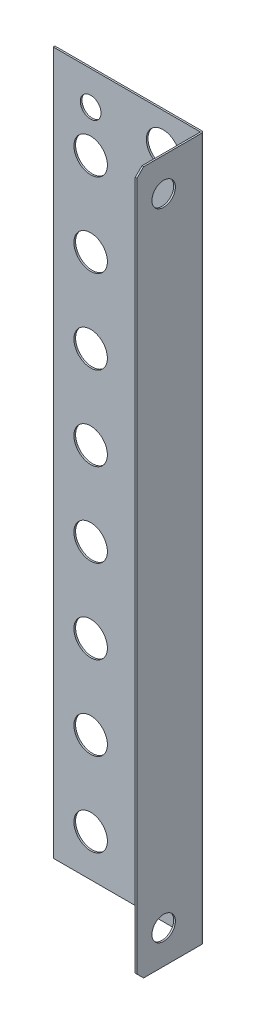
ISO-10303-21;
HEADER;
FILE_DESCRIPTION(('STEP AP214'),'2;1');
FILE_NAME('part.step','',(''),(''),'','','');
FILE_SCHEMA(('AUTOMOTIVE_DESIGN { 1 0 10303 214 1 1 1 1 }'));
ENDSEC;
DATA;
#1=APPLICATION_CONTEXT('core data for automotive mechanical design processes');
#2=APPLICATION_PROTOCOL_DEFINITION('international standard','automotive_design',2000,#1);
#3=PRODUCT_CONTEXT('',#1,'mechanical');
#4=PRODUCT('Part','Part','',(#3));
#5=PRODUCT_RELATED_PRODUCT_CATEGORY('part','',(#4));
#6=PRODUCT_DEFINITION_FORMATION('','',#4);
#7=PRODUCT_DEFINITION_CONTEXT('part definition',#1,'design');
#8=PRODUCT_DEFINITION('design','',#6,#7);
#9=PRODUCT_DEFINITION_SHAPE('','',#8);
#10=(LENGTH_UNIT() NAMED_UNIT(*) SI_UNIT(.MILLI.,.METRE.));
#11=(NAMED_UNIT(*) PLANE_ANGLE_UNIT() SI_UNIT($,.RADIAN.));
#12=(NAMED_UNIT(*) SI_UNIT($,.STERADIAN.) SOLID_ANGLE_UNIT());
#13=UNCERTAINTY_MEASURE_WITH_UNIT(LENGTH_MEASURE(1.E-05),#10,'distance_accuracy_value','');
#14=(GEOMETRIC_REPRESENTATION_CONTEXT(3) GLOBAL_UNCERTAINTY_ASSIGNED_CONTEXT((#13)) GLOBAL_UNIT_ASSIGNED_CONTEXT((#10,
#11,#12)) REPRESENTATION_CONTEXT('',''));
#15=CARTESIAN_POINT('',(0.,0.,0.));
#16=DIRECTION('',(0.,0.,1.));
#17=DIRECTION('',(1.,0.,0.));
#18=AXIS2_PLACEMENT_3D('',#15,#16,#17);
#19=CARTESIAN_POINT('',(-22.,105.,-0.5));
#20=DIRECTION('',(0.,1.,0.));
#21=DIRECTION('',(0.,0.,1.));
#22=AXIS2_PLACEMENT_3D('',#19,#20,#21);
#23=PLANE('',#22);
#24=DIRECTION('',(-1.,0.,0.));
#25=VECTOR('',#24,1.);
#26=CARTESIAN_POINT('',(-22.,105.,0.));
#27=LINE('',#26,#25);
#28=CARTESIAN_POINT('',(21.95,105.,0.));
#29=VERTEX_POINT('',#28);
#30=CARTESIAN_POINT('',(-22.,105.,0.));
#31=VERTEX_POINT('',#30);
#32=EDGE_CURVE('E205',#29,#31,#27,.T.);
#33=ORIENTED_EDGE('',*,*,#32,.F.);
#34=DIRECTION('',(-2.77555756156204E-13,0.,-1.));
#35=VECTOR('',#34,1.);
#36=CARTESIAN_POINT('',(21.95,105.,0.));
#37=LINE('',#36,#35);
#38=CARTESIAN_POINT('',(21.9499999999998,105.,-0.500000000000012));
#39=VERTEX_POINT('',#38);
#40=EDGE_CURVE('E163',#29,#39,#37,.T.);
#41=ORIENTED_EDGE('',*,*,#40,.T.);
#42=DIRECTION('',(-1.,0.,0.));
#43=VECTOR('',#42,1.);
#44=CARTESIAN_POINT('',(-22.,105.,-0.5));
#45=LINE('',#44,#43);
#46=CARTESIAN_POINT('',(-22.,105.,-0.5));
#47=VERTEX_POINT('',#46);
#48=EDGE_CURVE('E195',#39,#47,#45,.T.);
#49=ORIENTED_EDGE('',*,*,#48,.T.);
#50=DIRECTION('',(0.,0.,1.));
#51=VECTOR('',#50,1.);
#52=CARTESIAN_POINT('',(-22.,105.,-0.5));
#53=LINE('',#52,#51);
#54=EDGE_CURVE('E204',#47,#31,#53,.T.);
#55=ORIENTED_EDGE('',*,*,#54,.T.);
#56=EDGE_LOOP('',(#33,#41,#49,#55));
#57=FACE_BOUND('',#56,.T.);
#58=ADVANCED_FACE('F40',(#57),#23,.T.);
#59=CARTESIAN_POINT('',(0.,0.,-0.5));
#60=DIRECTION('',(0.,0.,1.));
#61=DIRECTION('',(1.,0.,0.));
#62=AXIS2_PLACEMENT_3D('',#59,#60,#61);
#63=PLANE('',#62);
#64=CARTESIAN_POINT('',(-10.8253175473055,95.,-0.500000000000012));
#65=DIRECTION('',(0.,0.,1.));
#66=DIRECTION('',(1.,0.,0.));
#67=AXIS2_PLACEMENT_3D('',#64,#65,#66);
#68=CIRCLE('',#67,3.10000000000001);
#69=CARTESIAN_POINT('',(-7.72531754730549,95.,-0.500000000000012));
#70=VERTEX_POINT('',#69);
#71=EDGE_CURVE('E315',#70,#70,#68,.T.);
#72=ORIENTED_EDGE('',*,*,#71,.T.);
#73=EDGE_LOOP('',(#72));
#74=FACE_BOUND('',#73,.T.);
#75=CARTESIAN_POINT('',(10.8253175473055,-92.5,-0.500000000000012));
#76=DIRECTION('',(0.,0.,1.));
#77=DIRECTION('',(1.,0.,0.));
#78=AXIS2_PLACEMENT_3D('',#75,#76,#77);
#79=CIRCLE('',#78,3.1);
#80=CARTESIAN_POINT('',(13.9253175473055,-92.5,-0.500000000000012));
#81=VERTEX_POINT('',#80);
#82=EDGE_CURVE('E320',#81,#81,#79,.T.);
#83=ORIENTED_EDGE('',*,*,#82,.T.);
#84=EDGE_LOOP('',(#83));
#85=FACE_BOUND('',#84,.T.);
#86=CARTESIAN_POINT('',(-10.8253175473055,-92.5,-0.5));
#87=DIRECTION('',(0.,0.,1.));
#88=DIRECTION('',(1.,0.,0.));
#89=AXIS2_PLACEMENT_3D('',#86,#87,#88);
#90=CIRCLE('',#89,5.);
#91=CARTESIAN_POINT('',(-5.82531754730547,-92.5,-0.5));
#92=VERTEX_POINT('',#91);
#93=EDGE_CURVE('E290',#92,#92,#90,.T.);
#94=ORIENTED_EDGE('',*,*,#93,.T.);
#95=EDGE_LOOP('',(#94));
#96=FACE_BOUND('',#95,.T.);
#97=CARTESIAN_POINT('',(-10.8253175473055,-67.5,-0.5));
#98=DIRECTION('',(0.,0.,1.));
#99=DIRECTION('',(1.,0.,0.));
#100=AXIS2_PLACEMENT_3D('',#97,#98,#99);
#101=CIRCLE('',#100,5.);
#102=CARTESIAN_POINT('',(-5.82531754730547,-67.5,-0.5));
#103=VERTEX_POINT('',#102);
#104=EDGE_CURVE('E284',#103,#103,#101,.T.);
#105=ORIENTED_EDGE('',*,*,#104,.T.);
#106=EDGE_LOOP('',(#105));
#107=FACE_BOUND('',#106,.T.);
#108=CARTESIAN_POINT('',(-10.8253175473055,-42.5,-0.5));
#109=DIRECTION('',(0.,0.,1.));
#110=DIRECTION('',(1.,0.,0.));
#111=AXIS2_PLACEMENT_3D('',#108,#109,#110);
#112=CIRCLE('',#111,5.);
#113=CARTESIAN_POINT('',(-5.82531754730547,-42.5,-0.5));
#114=VERTEX_POINT('',#113);
#115=EDGE_CURVE('E278',#114,#114,#112,.T.);
#116=ORIENTED_EDGE('',*,*,#115,.T.);
#117=EDGE_LOOP('',(#116));
#118=FACE_BOUND('',#117,.T.);
#119=CARTESIAN_POINT('',(-10.8253175473055,-17.5,-0.5));
#120=DIRECTION('',(0.,0.,1.));
#121=DIRECTION('',(1.,0.,0.));
#122=AXIS2_PLACEMENT_3D('',#119,#120,#121);
#123=CIRCLE('',#122,5.);
#124=CARTESIAN_POINT('',(-5.82531754730548,-17.5,-0.5));
#125=VERTEX_POINT('',#124);
#126=EDGE_CURVE('E272',#125,#125,#123,.T.);
#127=ORIENTED_EDGE('',*,*,#126,.T.);
#128=EDGE_LOOP('',(#127));
#129=FACE_BOUND('',#128,.T.);
#130=CARTESIAN_POINT('',(-10.8253175473055,7.49999999999999,-0.5));
#131=DIRECTION('',(0.,0.,1.));
#132=DIRECTION('',(1.,0.,0.));
#133=AXIS2_PLACEMENT_3D('',#130,#131,#132);
#134=CIRCLE('',#133,5.);
#135=CARTESIAN_POINT('',(-5.82531754730548,7.49999999999999,-0.5));
#136=VERTEX_POINT('',#135);
#137=EDGE_CURVE('E266',#136,#136,#134,.T.);
#138=ORIENTED_EDGE('',*,*,#137,.T.);
#139=EDGE_LOOP('',(#138));
#140=FACE_BOUND('',#139,.T.);
#141=CARTESIAN_POINT('',(-10.8253175473055,32.5,-0.5));
#142=DIRECTION('',(0.,0.,1.));
#143=DIRECTION('',(1.,0.,0.));
#144=AXIS2_PLACEMENT_3D('',#141,#142,#143);
#145=CIRCLE('',#144,5.);
#146=CARTESIAN_POINT('',(-5.82531754730548,32.5,-0.5));
#147=VERTEX_POINT('',#146);
#148=EDGE_CURVE('E260',#147,#147,#145,.T.);
#149=ORIENTED_EDGE('',*,*,#148,.T.);
#150=EDGE_LOOP('',(#149));
#151=FACE_BOUND('',#150,.T.);
#152=CARTESIAN_POINT('',(10.8253175473055,-80.,-0.5));
#153=DIRECTION('',(0.,0.,1.));
#154=DIRECTION('',(1.,0.,0.));
#155=AXIS2_PLACEMENT_3D('',#152,#153,#154);
#156=CIRCLE('',#155,5.);
#157=CARTESIAN_POINT('',(15.8253175473055,-80.,-0.5));
#158=VERTEX_POINT('',#157);
#159=EDGE_CURVE('E254',#158,#158,#156,.T.);
#160=ORIENTED_EDGE('',*,*,#159,.T.);
#161=EDGE_LOOP('',(#160));
#162=FACE_BOUND('',#161,.T.);
#163=CARTESIAN_POINT('',(10.8253175473055,-55.,-0.5));
#164=DIRECTION('',(0.,0.,1.));
#165=DIRECTION('',(1.,0.,0.));
#166=AXIS2_PLACEMENT_3D('',#163,#164,#165);
#167=CIRCLE('',#166,5.);
#168=CARTESIAN_POINT('',(15.8253175473055,-55.,-0.5));
#169=VERTEX_POINT('',#168);
#170=EDGE_CURVE('E248',#169,#169,#167,.T.);
#171=ORIENTED_EDGE('',*,*,#170,.T.);
#172=EDGE_LOOP('',(#171));
#173=FACE_BOUND('',#172,.T.);
#174=CARTESIAN_POINT('',(10.8253175473055,-30.,-0.5));
#175=DIRECTION('',(0.,0.,1.));
#176=DIRECTION('',(1.,0.,0.));
#177=AXIS2_PLACEMENT_3D('',#174,#175,#176);
#178=CIRCLE('',#177,5.);
#179=CARTESIAN_POINT('',(15.8253175473055,-30.,-0.5));
#180=VERTEX_POINT('',#179);
#181=EDGE_CURVE('E242',#180,#180,#178,.T.);
#182=ORIENTED_EDGE('',*,*,#181,.T.);
#183=EDGE_LOOP('',(#182));
#184=FACE_BOUND('',#183,.T.);
#185=CARTESIAN_POINT('',(10.8253175473055,-5.,-0.5));
#186=DIRECTION('',(0.,0.,1.));
#187=DIRECTION('',(1.,0.,0.));
#188=AXIS2_PLACEMENT_3D('',#185,#186,#187);
#189=CIRCLE('',#188,5.);
#190=CARTESIAN_POINT('',(15.8253175473055,-5.,-0.5));
#191=VERTEX_POINT('',#190);
#192=EDGE_CURVE('E236',#191,#191,#189,.T.);
#193=ORIENTED_EDGE('',*,*,#192,.T.);
#194=EDGE_LOOP('',(#193));
#195=FACE_BOUND('',#194,.T.);
#196=CARTESIAN_POINT('',(10.8253175473055,20.,-0.5));
#197=DIRECTION('',(0.,0.,1.));
#198=DIRECTION('',(1.,0.,0.));
#199=AXIS2_PLACEMENT_3D('',#196,#197,#198);
#200=CIRCLE('',#199,5.);
#201=CARTESIAN_POINT('',(15.8253175473055,20.,-0.5));
#202=VERTEX_POINT('',#201);
#203=EDGE_CURVE('E230',#202,#202,#200,.T.);
#204=ORIENTED_EDGE('',*,*,#203,.T.);
#205=EDGE_LOOP('',(#204));
#206=FACE_BOUND('',#205,.T.);
#207=CARTESIAN_POINT('',(10.8253175473055,45.,-0.5));
#208=DIRECTION('',(0.,0.,1.));
#209=DIRECTION('',(1.,0.,0.));
#210=AXIS2_PLACEMENT_3D('',#207,#208,#209);
#211=CIRCLE('',#210,5.);
#212=CARTESIAN_POINT('',(15.8253175473055,45.,-0.5));
#213=VERTEX_POINT('',#212);
#214=EDGE_CURVE('E224',#213,#213,#211,.T.);
#215=ORIENTED_EDGE('',*,*,#214,.T.);
#216=EDGE_LOOP('',(#215));
#217=FACE_BOUND('',#216,.T.);
#218=CARTESIAN_POINT('',(-10.8253175473055,82.5,-0.5));
#219=DIRECTION('',(0.,0.,1.));
#220=DIRECTION('',(1.,0.,0.));
#221=AXIS2_PLACEMENT_3D('',#218,#219,#220);
#222=CIRCLE('',#221,5.);
#223=CARTESIAN_POINT('',(-5.82531754730549,82.5,-0.5));
#224=VERTEX_POINT('',#223);
#225=EDGE_CURVE('E188',#224,#224,#222,.T.);
#226=ORIENTED_EDGE('',*,*,#225,.T.);
#227=EDGE_LOOP('',(#226));
#228=FACE_BOUND('',#227,.T.);
#229=CARTESIAN_POINT('',(10.8253175473055,95.,-0.5));
#230=DIRECTION('',(0.,0.,1.));
#231=DIRECTION('',(1.,0.,0.));
#232=AXIS2_PLACEMENT_3D('',#229,#230,#231);
#233=CIRCLE('',#232,5.);
#234=CARTESIAN_POINT('',(15.8253175473055,95.,-0.5));
#235=VERTEX_POINT('',#234);
#236=EDGE_CURVE('E189',#235,#235,#233,.T.);
#237=ORIENTED_EDGE('',*,*,#236,.T.);
#238=EDGE_LOOP('',(#237));
#239=FACE_BOUND('',#238,.T.);
#240=CARTESIAN_POINT('',(10.8253175473055,70.,-0.5));
#241=DIRECTION('',(0.,0.,1.));
#242=DIRECTION('',(1.,0.,0.));
#243=AXIS2_PLACEMENT_3D('',#240,#241,#242);
#244=CIRCLE('',#243,5.);
#245=CARTESIAN_POINT('',(15.8253175473055,70.,-0.5));
#246=VERTEX_POINT('',#245);
#247=EDGE_CURVE('E185',#246,#246,#244,.T.);
#248=ORIENTED_EDGE('',*,*,#247,.T.);
#249=EDGE_LOOP('',(#248));
#250=FACE_BOUND('',#249,.T.);
#251=CARTESIAN_POINT('',(-10.8253175473055,57.5,-0.5));
#252=DIRECTION('',(0.,0.,1.));
#253=DIRECTION('',(1.,0.,0.));
#254=AXIS2_PLACEMENT_3D('',#251,#252,#253);
#255=CIRCLE('',#254,5.);
#256=CARTESIAN_POINT('',(-5.82531754730549,57.5,-0.5));
#257=VERTEX_POINT('',#256);
#258=EDGE_CURVE('E179',#257,#257,#255,.T.);
#259=ORIENTED_EDGE('',*,*,#258,.T.);
#260=EDGE_LOOP('',(#259));
#261=FACE_BOUND('',#260,.T.);
#262=DIRECTION('',(0.,1.,0.));
#263=VECTOR('',#262,1.);
#264=CARTESIAN_POINT('',(21.9499999999998,105.,-0.500000000000012));
#265=LINE('',#264,#263);
#266=CARTESIAN_POINT('',(21.95,-105.,-0.5));
#267=VERTEX_POINT('',#266);
#268=EDGE_CURVE('E128',#39,#267,#265,.F.);
#269=ORIENTED_EDGE('',*,*,#268,.T.);
#270=DIRECTION('',(1.,0.,0.));
#271=VECTOR('',#270,1.);
#272=CARTESIAN_POINT('',(-22.,-105.,-0.5));
#273=LINE('',#272,#271);
#274=CARTESIAN_POINT('',(-22.,-105.,-0.5));
#275=VERTEX_POINT('',#274);
#276=EDGE_CURVE('E201',#275,#267,#273,.T.);
#277=ORIENTED_EDGE('',*,*,#276,.F.);
#278=DIRECTION('',(0.,-1.,0.));
#279=VECTOR('',#278,1.);
#280=CARTESIAN_POINT('',(-22.,105.,-0.5));
#281=LINE('',#280,#279);
#282=EDGE_CURVE('E197',#47,#275,#281,.T.);
#283=ORIENTED_EDGE('',*,*,#282,.F.);
#284=ORIENTED_EDGE('',*,*,#48,.F.);
#285=EDGE_LOOP('',(#269,#277,#283,#284));
#286=FACE_BOUND('',#285,.T.);
#287=ADVANCED_FACE('F370',(#74,#85,#96,#107,#118,#129,#140,#151,#162,#173,#184,#195,#206,#217,
#228,#239,#250,#261,#286),#63,.F.);
#288=CARTESIAN_POINT('',(0.,0.,0.));
#289=DIRECTION('',(0.,0.,1.));
#290=DIRECTION('',(1.,0.,0.));
#291=AXIS2_PLACEMENT_3D('',#288,#289,#290);
#292=PLANE('',#291);
#293=CARTESIAN_POINT('',(-10.8253175473055,95.,0.));
#294=DIRECTION('',(0.,0.,1.));
#295=DIRECTION('',(1.,0.,0.));
#296=AXIS2_PLACEMENT_3D('',#293,#294,#295);
#297=CIRCLE('',#296,3.10000000000001);
#298=CARTESIAN_POINT('',(-7.72531754730549,95.,0.));
#299=VERTEX_POINT('',#298);
#300=EDGE_CURVE('E45',#299,#299,#297,.T.);
#301=ORIENTED_EDGE('',*,*,#300,.F.);
#302=EDGE_LOOP('',(#301));
#303=FACE_BOUND('',#302,.T.);
#304=CARTESIAN_POINT('',(10.8253175473055,-92.5,0.));
#305=DIRECTION('',(0.,0.,1.));
#306=DIRECTION('',(1.,0.,0.));
#307=AXIS2_PLACEMENT_3D('',#304,#305,#306);
#308=CIRCLE('',#307,3.1);
#309=CARTESIAN_POINT('',(13.9253175473055,-92.5,0.));
#310=VERTEX_POINT('',#309);
#311=EDGE_CURVE('E313',#310,#310,#308,.T.);
#312=ORIENTED_EDGE('',*,*,#311,.F.);
#313=EDGE_LOOP('',(#312));
#314=FACE_BOUND('',#313,.T.);
#315=CARTESIAN_POINT('',(-10.8253175473055,57.5,0.));
#316=DIRECTION('',(0.,0.,1.));
#317=DIRECTION('',(1.,0.,0.));
#318=AXIS2_PLACEMENT_3D('',#315,#316,#317);
#319=CIRCLE('',#318,5.);
#320=CARTESIAN_POINT('',(-5.82531754730549,57.5,0.));
#321=VERTEX_POINT('',#320);
#322=EDGE_CURVE('E174',#321,#321,#319,.T.);
#323=ORIENTED_EDGE('',*,*,#322,.F.);
#324=EDGE_LOOP('',(#323));
#325=FACE_BOUND('',#324,.T.);
#326=CARTESIAN_POINT('',(10.8253175473055,70.,0.));
#327=DIRECTION('',(0.,0.,1.));
#328=DIRECTION('',(1.,0.,0.));
#329=AXIS2_PLACEMENT_3D('',#326,#327,#328);
#330=CIRCLE('',#329,5.);
#331=CARTESIAN_POINT('',(15.8253175473055,70.,0.));
#332=VERTEX_POINT('',#331);
#333=EDGE_CURVE('E182',#332,#332,#330,.T.);
#334=ORIENTED_EDGE('',*,*,#333,.F.);
#335=EDGE_LOOP('',(#334));
#336=FACE_BOUND('',#335,.T.);
#337=CARTESIAN_POINT('',(10.8253175473055,95.,0.));
#338=DIRECTION('',(0.,0.,1.));
#339=DIRECTION('',(1.,0.,0.));
#340=AXIS2_PLACEMENT_3D('',#337,#338,#339);
#341=CIRCLE('',#340,5.);
#342=CARTESIAN_POINT('',(15.8253175473055,95.,0.));
#343=VERTEX_POINT('',#342);
#344=EDGE_CURVE('E208',#343,#343,#341,.T.);
#345=ORIENTED_EDGE('',*,*,#344,.F.);
#346=EDGE_LOOP('',(#345));
#347=FACE_BOUND('',#346,.T.);
#348=CARTESIAN_POINT('',(-10.8253175473055,82.5,0.));
#349=DIRECTION('',(0.,0.,1.));
#350=DIRECTION('',(1.,0.,0.));
#351=AXIS2_PLACEMENT_3D('',#348,#349,#350);
#352=CIRCLE('',#351,5.);
#353=CARTESIAN_POINT('',(-5.82531754730549,82.5,0.));
#354=VERTEX_POINT('',#353);
#355=EDGE_CURVE('E192',#354,#354,#352,.T.);
#356=ORIENTED_EDGE('',*,*,#355,.F.);
#357=EDGE_LOOP('',(#356));
#358=FACE_BOUND('',#357,.T.);
#359=CARTESIAN_POINT('',(10.8253175473055,45.,0.));
#360=DIRECTION('',(0.,0.,1.));
#361=DIRECTION('',(1.,0.,0.));
#362=AXIS2_PLACEMENT_3D('',#359,#360,#361);
#363=CIRCLE('',#362,5.);
#364=CARTESIAN_POINT('',(15.8253175473055,45.,0.));
#365=VERTEX_POINT('',#364);
#366=EDGE_CURVE('E215',#365,#365,#363,.T.);
#367=ORIENTED_EDGE('',*,*,#366,.F.);
#368=EDGE_LOOP('',(#367));
#369=FACE_BOUND('',#368,.T.);
#370=CARTESIAN_POINT('',(10.8253175473055,20.,0.));
#371=DIRECTION('',(0.,0.,1.));
#372=DIRECTION('',(1.,0.,0.));
#373=AXIS2_PLACEMENT_3D('',#370,#371,#372);
#374=CIRCLE('',#373,5.);
#375=CARTESIAN_POINT('',(15.8253175473055,20.,0.));
#376=VERTEX_POINT('',#375);
#377=EDGE_CURVE('E227',#376,#376,#374,.T.);
#378=ORIENTED_EDGE('',*,*,#377,.F.);
#379=EDGE_LOOP('',(#378));
#380=FACE_BOUND('',#379,.T.);
#381=CARTESIAN_POINT('',(10.8253175473055,-5.,0.));
#382=DIRECTION('',(0.,0.,1.));
#383=DIRECTION('',(1.,0.,0.));
#384=AXIS2_PLACEMENT_3D('',#381,#382,#383);
#385=CIRCLE('',#384,5.);
#386=CARTESIAN_POINT('',(15.8253175473055,-5.,0.));
#387=VERTEX_POINT('',#386);
#388=EDGE_CURVE('E233',#387,#387,#385,.T.);
#389=ORIENTED_EDGE('',*,*,#388,.F.);
#390=EDGE_LOOP('',(#389));
#391=FACE_BOUND('',#390,.T.);
#392=CARTESIAN_POINT('',(10.8253175473055,-30.,0.));
#393=DIRECTION('',(0.,0.,1.));
#394=DIRECTION('',(1.,0.,0.));
#395=AXIS2_PLACEMENT_3D('',#392,#393,#394);
#396=CIRCLE('',#395,5.);
#397=CARTESIAN_POINT('',(15.8253175473055,-30.,0.));
#398=VERTEX_POINT('',#397);
#399=EDGE_CURVE('E239',#398,#398,#396,.T.);
#400=ORIENTED_EDGE('',*,*,#399,.F.);
#401=EDGE_LOOP('',(#400));
#402=FACE_BOUND('',#401,.T.);
#403=CARTESIAN_POINT('',(10.8253175473055,-55.,0.));
#404=DIRECTION('',(0.,0.,1.));
#405=DIRECTION('',(1.,0.,0.));
#406=AXIS2_PLACEMENT_3D('',#403,#404,#405);
#407=CIRCLE('',#406,5.);
#408=CARTESIAN_POINT('',(15.8253175473055,-55.,0.));
#409=VERTEX_POINT('',#408);
#410=EDGE_CURVE('E245',#409,#409,#407,.T.);
#411=ORIENTED_EDGE('',*,*,#410,.F.);
#412=EDGE_LOOP('',(#411));
#413=FACE_BOUND('',#412,.T.);
#414=CARTESIAN_POINT('',(10.8253175473055,-80.,0.));
#415=DIRECTION('',(0.,0.,1.));
#416=DIRECTION('',(1.,0.,0.));
#417=AXIS2_PLACEMENT_3D('',#414,#415,#416);
#418=CIRCLE('',#417,5.);
#419=CARTESIAN_POINT('',(15.8253175473055,-80.,0.));
#420=VERTEX_POINT('',#419);
#421=EDGE_CURVE('E251',#420,#420,#418,.T.);
#422=ORIENTED_EDGE('',*,*,#421,.F.);
#423=EDGE_LOOP('',(#422));
#424=FACE_BOUND('',#423,.T.);
#425=CARTESIAN_POINT('',(-10.8253175473055,32.5,0.));
#426=DIRECTION('',(0.,0.,1.));
#427=DIRECTION('',(1.,0.,0.));
#428=AXIS2_PLACEMENT_3D('',#425,#426,#427);
#429=CIRCLE('',#428,5.);
#430=CARTESIAN_POINT('',(-5.82531754730548,32.5,0.));
#431=VERTEX_POINT('',#430);
#432=EDGE_CURVE('E257',#431,#431,#429,.T.);
#433=ORIENTED_EDGE('',*,*,#432,.F.);
#434=EDGE_LOOP('',(#433));
#435=FACE_BOUND('',#434,.T.);
#436=CARTESIAN_POINT('',(-10.8253175473055,7.49999999999999,0.));
#437=DIRECTION('',(0.,0.,1.));
#438=DIRECTION('',(1.,0.,0.));
#439=AXIS2_PLACEMENT_3D('',#436,#437,#438);
#440=CIRCLE('',#439,5.);
#441=CARTESIAN_POINT('',(-5.82531754730548,7.49999999999999,0.));
#442=VERTEX_POINT('',#441);
#443=EDGE_CURVE('E263',#442,#442,#440,.T.);
#444=ORIENTED_EDGE('',*,*,#443,.F.);
#445=EDGE_LOOP('',(#444));
#446=FACE_BOUND('',#445,.T.);
#447=CARTESIAN_POINT('',(-10.8253175473055,-17.5,0.));
#448=DIRECTION('',(0.,0.,1.));
#449=DIRECTION('',(1.,0.,0.));
#450=AXIS2_PLACEMENT_3D('',#447,#448,#449);
#451=CIRCLE('',#450,5.);
#452=CARTESIAN_POINT('',(-5.82531754730548,-17.5,0.));
#453=VERTEX_POINT('',#452);
#454=EDGE_CURVE('E269',#453,#453,#451,.T.);
#455=ORIENTED_EDGE('',*,*,#454,.F.);
#456=EDGE_LOOP('',(#455));
#457=FACE_BOUND('',#456,.T.);
#458=CARTESIAN_POINT('',(-10.8253175473055,-42.5,0.));
#459=DIRECTION('',(0.,0.,1.));
#460=DIRECTION('',(1.,0.,0.));
#461=AXIS2_PLACEMENT_3D('',#458,#459,#460);
#462=CIRCLE('',#461,5.);
#463=CARTESIAN_POINT('',(-5.82531754730547,-42.5,0.));
#464=VERTEX_POINT('',#463);
#465=EDGE_CURVE('E275',#464,#464,#462,.T.);
#466=ORIENTED_EDGE('',*,*,#465,.F.);
#467=EDGE_LOOP('',(#466));
#468=FACE_BOUND('',#467,.T.);
#469=CARTESIAN_POINT('',(-10.8253175473055,-67.5,0.));
#470=DIRECTION('',(0.,0.,1.));
#471=DIRECTION('',(1.,0.,0.));
#472=AXIS2_PLACEMENT_3D('',#469,#470,#471);
#473=CIRCLE('',#472,5.);
#474=CARTESIAN_POINT('',(-5.82531754730547,-67.5,0.));
#475=VERTEX_POINT('',#474);
#476=EDGE_CURVE('E281',#475,#475,#473,.T.);
#477=ORIENTED_EDGE('',*,*,#476,.F.);
#478=EDGE_LOOP('',(#477));
#479=FACE_BOUND('',#478,.T.);
#480=CARTESIAN_POINT('',(-10.8253175473055,-92.5,0.));
#481=DIRECTION('',(0.,0.,1.));
#482=DIRECTION('',(1.,0.,0.));
#483=AXIS2_PLACEMENT_3D('',#480,#481,#482);
#484=CIRCLE('',#483,5.);
#485=CARTESIAN_POINT('',(-5.82531754730547,-92.5,0.));
#486=VERTEX_POINT('',#485);
#487=EDGE_CURVE('E287',#486,#486,#484,.T.);
#488=ORIENTED_EDGE('',*,*,#487,.F.);
#489=EDGE_LOOP('',(#488));
#490=FACE_BOUND('',#489,.T.);
#491=DIRECTION('',(1.,0.,0.));
#492=VECTOR('',#491,1.);
#493=CARTESIAN_POINT('',(-22.,-105.,0.));
#494=LINE('',#493,#492);
#495=CARTESIAN_POINT('',(-22.,-105.,0.));
#496=VERTEX_POINT('',#495);
#497=CARTESIAN_POINT('',(21.95,-105.,0.));
#498=VERTEX_POINT('',#497);
#499=EDGE_CURVE('E198',#496,#498,#494,.T.);
#500=ORIENTED_EDGE('',*,*,#499,.T.);
#501=DIRECTION('',(0.,1.,0.));
#502=VECTOR('',#501,1.);
#503=CARTESIAN_POINT('',(21.95,105.,0.));
#504=LINE('',#503,#502);
#505=EDGE_CURVE('E167',#29,#498,#504,.F.);
#506=ORIENTED_EDGE('',*,*,#505,.F.);
#507=ORIENTED_EDGE('',*,*,#32,.T.);
#508=DIRECTION('',(0.,-1.,0.));
#509=VECTOR('',#508,1.);
#510=CARTESIAN_POINT('',(-22.,105.,0.));
#511=LINE('',#510,#509);
#512=EDGE_CURVE('E207',#31,#496,#511,.T.);
#513=ORIENTED_EDGE('',*,*,#512,.T.);
#514=EDGE_LOOP('',(#500,#506,#507,#513));
#515=FACE_BOUND('',#514,.T.);
#516=ADVANCED_FACE('F377',(#303,#314,#325,#336,#347,#358,#369,#380,#391,#402,#413,#424,#435,
#446,#457,#468,#479,#490,#515),#292,.T.);
#517=CARTESIAN_POINT('',(-10.8253175473055,-92.5,-0.5));
#518=DIRECTION('',(0.,0.,1.));
#519=DIRECTION('',(1.,0.,0.));
#520=AXIS2_PLACEMENT_3D('',#517,#518,#519);
#521=CYLINDRICAL_SURFACE('',#520,5.);
#522=ORIENTED_EDGE('',*,*,#487,.T.);
#523=EDGE_LOOP('',(#522));
#524=FACE_BOUND('',#523,.T.);
#525=ORIENTED_EDGE('',*,*,#93,.F.);
#526=EDGE_LOOP('',(#525));
#527=FACE_BOUND('',#526,.T.);
#528=ADVANCED_FACE('F427',(#524,#527),#521,.F.);
#529=CARTESIAN_POINT('',(-10.8253175473055,-67.5,-0.5));
#530=DIRECTION('',(0.,0.,1.));
#531=DIRECTION('',(1.,0.,0.));
#532=AXIS2_PLACEMENT_3D('',#529,#530,#531);
#533=CYLINDRICAL_SURFACE('',#532,5.);
#534=ORIENTED_EDGE('',*,*,#476,.T.);
#535=EDGE_LOOP('',(#534));
#536=FACE_BOUND('',#535,.T.);
#537=ORIENTED_EDGE('',*,*,#104,.F.);
#538=EDGE_LOOP('',(#537));
#539=FACE_BOUND('',#538,.T.);
#540=ADVANCED_FACE('F424',(#536,#539),#533,.F.);
#541=CARTESIAN_POINT('',(-10.8253175473055,-42.5,-0.5));
#542=DIRECTION('',(0.,0.,1.));
#543=DIRECTION('',(1.,0.,0.));
#544=AXIS2_PLACEMENT_3D('',#541,#542,#543);
#545=CYLINDRICAL_SURFACE('',#544,5.);
#546=ORIENTED_EDGE('',*,*,#465,.T.);
#547=EDGE_LOOP('',(#546));
#548=FACE_BOUND('',#547,.T.);
#549=ORIENTED_EDGE('',*,*,#115,.F.);
#550=EDGE_LOOP('',(#549));
#551=FACE_BOUND('',#550,.T.);
#552=ADVANCED_FACE('F420',(#548,#551),#545,.F.);
#553=CARTESIAN_POINT('',(-10.8253175473055,-17.5,-0.5));
#554=DIRECTION('',(0.,0.,1.));
#555=DIRECTION('',(1.,0.,0.));
#556=AXIS2_PLACEMENT_3D('',#553,#554,#555);
#557=CYLINDRICAL_SURFACE('',#556,5.);
#558=ORIENTED_EDGE('',*,*,#454,.T.);
#559=EDGE_LOOP('',(#558));
#560=FACE_BOUND('',#559,.T.);
#561=ORIENTED_EDGE('',*,*,#126,.F.);
#562=EDGE_LOOP('',(#561));
#563=FACE_BOUND('',#562,.T.);
#564=ADVANCED_FACE('F416',(#560,#563),#557,.F.);
#565=CARTESIAN_POINT('',(-10.8253175473055,7.49999999999999,-0.5));
#566=DIRECTION('',(0.,0.,1.));
#567=DIRECTION('',(1.,0.,0.));
#568=AXIS2_PLACEMENT_3D('',#565,#566,#567);
#569=CYLINDRICAL_SURFACE('',#568,5.);
#570=ORIENTED_EDGE('',*,*,#443,.T.);
#571=EDGE_LOOP('',(#570));
#572=FACE_BOUND('',#571,.T.);
#573=ORIENTED_EDGE('',*,*,#137,.F.);
#574=EDGE_LOOP('',(#573));
#575=FACE_BOUND('',#574,.T.);
#576=ADVANCED_FACE('F412',(#572,#575),#569,.F.);
#577=CARTESIAN_POINT('',(-10.8253175473055,32.5,-0.5));
#578=DIRECTION('',(0.,0.,1.));
#579=DIRECTION('',(1.,0.,0.));
#580=AXIS2_PLACEMENT_3D('',#577,#578,#579);
#581=CYLINDRICAL_SURFACE('',#580,5.);
#582=ORIENTED_EDGE('',*,*,#432,.T.);
#583=EDGE_LOOP('',(#582));
#584=FACE_BOUND('',#583,.T.);
#585=ORIENTED_EDGE('',*,*,#148,.F.);
#586=EDGE_LOOP('',(#585));
#587=FACE_BOUND('',#586,.T.);
#588=ADVANCED_FACE('F408',(#584,#587),#581,.F.);
#589=CARTESIAN_POINT('',(10.8253175473055,-80.,-0.5));
#590=DIRECTION('',(0.,0.,1.));
#591=DIRECTION('',(1.,0.,0.));
#592=AXIS2_PLACEMENT_3D('',#589,#590,#591);
#593=CYLINDRICAL_SURFACE('',#592,5.);
#594=ORIENTED_EDGE('',*,*,#421,.T.);
#595=EDGE_LOOP('',(#594));
#596=FACE_BOUND('',#595,.T.);
#597=ORIENTED_EDGE('',*,*,#159,.F.);
#598=EDGE_LOOP('',(#597));
#599=FACE_BOUND('',#598,.T.);
#600=ADVANCED_FACE('F404',(#596,#599),#593,.F.);
#601=CARTESIAN_POINT('',(10.8253175473055,-55.,-0.5));
#602=DIRECTION('',(0.,0.,1.));
#603=DIRECTION('',(1.,0.,0.));
#604=AXIS2_PLACEMENT_3D('',#601,#602,#603);
#605=CYLINDRICAL_SURFACE('',#604,5.);
#606=ORIENTED_EDGE('',*,*,#410,.T.);
#607=EDGE_LOOP('',(#606));
#608=FACE_BOUND('',#607,.T.);
#609=ORIENTED_EDGE('',*,*,#170,.F.);
#610=EDGE_LOOP('',(#609));
#611=FACE_BOUND('',#610,.T.);
#612=ADVANCED_FACE('F400',(#608,#611),#605,.F.);
#613=CARTESIAN_POINT('',(10.8253175473055,-30.,-0.5));
#614=DIRECTION('',(0.,0.,1.));
#615=DIRECTION('',(1.,0.,0.));
#616=AXIS2_PLACEMENT_3D('',#613,#614,#615);
#617=CYLINDRICAL_SURFACE('',#616,5.);
#618=ORIENTED_EDGE('',*,*,#399,.T.);
#619=EDGE_LOOP('',(#618));
#620=FACE_BOUND('',#619,.T.);
#621=ORIENTED_EDGE('',*,*,#181,.F.);
#622=EDGE_LOOP('',(#621));
#623=FACE_BOUND('',#622,.T.);
#624=ADVANCED_FACE('F396',(#620,#623),#617,.F.);
#625=CARTESIAN_POINT('',(10.8253175473055,-5.,-0.5));
#626=DIRECTION('',(0.,0.,1.));
#627=DIRECTION('',(1.,0.,0.));
#628=AXIS2_PLACEMENT_3D('',#625,#626,#627);
#629=CYLINDRICAL_SURFACE('',#628,5.);
#630=ORIENTED_EDGE('',*,*,#388,.T.);
#631=EDGE_LOOP('',(#630));
#632=FACE_BOUND('',#631,.T.);
#633=ORIENTED_EDGE('',*,*,#192,.F.);
#634=EDGE_LOOP('',(#633));
#635=FACE_BOUND('',#634,.T.);
#636=ADVANCED_FACE('F392',(#632,#635),#629,.F.);
#637=CARTESIAN_POINT('',(10.8253175473055,20.,-0.5));
#638=DIRECTION('',(0.,0.,1.));
#639=DIRECTION('',(1.,0.,0.));
#640=AXIS2_PLACEMENT_3D('',#637,#638,#639);
#641=CYLINDRICAL_SURFACE('',#640,5.);
#642=ORIENTED_EDGE('',*,*,#377,.T.);
#643=EDGE_LOOP('',(#642));
#644=FACE_BOUND('',#643,.T.);
#645=ORIENTED_EDGE('',*,*,#203,.F.);
#646=EDGE_LOOP('',(#645));
#647=FACE_BOUND('',#646,.T.);
#648=ADVANCED_FACE('F388',(#644,#647),#641,.F.);
#649=CARTESIAN_POINT('',(10.8253175473055,45.,-0.5));
#650=DIRECTION('',(0.,0.,1.));
#651=DIRECTION('',(1.,0.,0.));
#652=AXIS2_PLACEMENT_3D('',#649,#650,#651);
#653=CYLINDRICAL_SURFACE('',#652,5.);
#654=ORIENTED_EDGE('',*,*,#366,.T.);
#655=EDGE_LOOP('',(#654));
#656=FACE_BOUND('',#655,.T.);
#657=ORIENTED_EDGE('',*,*,#214,.F.);
#658=EDGE_LOOP('',(#657));
#659=FACE_BOUND('',#658,.T.);
#660=ADVANCED_FACE('F384',(#656,#659),#653,.F.);
#661=CARTESIAN_POINT('',(-22.,-105.,-0.5));
#662=DIRECTION('',(0.,-1.,0.));
#663=DIRECTION('',(0.,0.,-1.));
#664=AXIS2_PLACEMENT_3D('',#661,#662,#663);
#665=PLANE('',#664);
#666=DIRECTION('',(-2.77555756156204E-13,0.,-1.));
#667=VECTOR('',#666,1.);
#668=CARTESIAN_POINT('',(21.95,-105.,0.));
#669=LINE('',#668,#667);
#670=EDGE_CURVE('E171',#498,#267,#669,.T.);
#671=ORIENTED_EDGE('',*,*,#670,.F.);
#672=ORIENTED_EDGE('',*,*,#499,.F.);
#673=DIRECTION('',(0.,0.,1.));
#674=VECTOR('',#673,1.);
#675=CARTESIAN_POINT('',(-22.,-105.,-0.5));
#676=LINE('',#675,#674);
#677=EDGE_CURVE('E213',#275,#496,#676,.T.);
#678=ORIENTED_EDGE('',*,*,#677,.F.);
#679=ORIENTED_EDGE('',*,*,#276,.T.);
#680=EDGE_LOOP('',(#671,#672,#678,#679));
#681=FACE_BOUND('',#680,.T.);
#682=ADVANCED_FACE('F387',(#681),#665,.T.);
#683=CARTESIAN_POINT('',(-22.,105.,-0.5));
#684=DIRECTION('',(-1.,0.,0.));
#685=DIRECTION('',(0.,-1.,0.));
#686=AXIS2_PLACEMENT_3D('',#683,#684,#685);
#687=PLANE('',#686);
#688=ORIENTED_EDGE('',*,*,#512,.F.);
#689=ORIENTED_EDGE('',*,*,#54,.F.);
#690=ORIENTED_EDGE('',*,*,#282,.T.);
#691=ORIENTED_EDGE('',*,*,#677,.T.);
#692=EDGE_LOOP('',(#688,#689,#690,#691));
#693=FACE_BOUND('',#692,.T.);
#694=ADVANCED_FACE('F382',(#693),#687,.T.);
#695=CARTESIAN_POINT('',(-10.8253175473055,82.5,-0.5));
#696=DIRECTION('',(0.,0.,1.));
#697=DIRECTION('',(1.,0.,0.));
#698=AXIS2_PLACEMENT_3D('',#695,#696,#697);
#699=CYLINDRICAL_SURFACE('',#698,5.);
#700=ORIENTED_EDGE('',*,*,#355,.T.);
#701=EDGE_LOOP('',(#700));
#702=FACE_BOUND('',#701,.T.);
#703=ORIENTED_EDGE('',*,*,#225,.F.);
#704=EDGE_LOOP('',(#703));
#705=FACE_BOUND('',#704,.T.);
#706=ADVANCED_FACE('F481',(#702,#705),#699,.F.);
#707=CARTESIAN_POINT('',(10.8253175473055,95.,-0.5));
#708=DIRECTION('',(0.,0.,1.));
#709=DIRECTION('',(1.,0.,0.));
#710=AXIS2_PLACEMENT_3D('',#707,#708,#709);
#711=CYLINDRICAL_SURFACE('',#710,5.);
#712=ORIENTED_EDGE('',*,*,#344,.T.);
#713=EDGE_LOOP('',(#712));
#714=FACE_BOUND('',#713,.T.);
#715=ORIENTED_EDGE('',*,*,#236,.F.);
#716=EDGE_LOOP('',(#715));
#717=FACE_BOUND('',#716,.T.);
#718=ADVANCED_FACE('F486',(#714,#717),#711,.F.);
#719=CARTESIAN_POINT('',(10.8253175473055,70.,-0.5));
#720=DIRECTION('',(0.,0.,1.));
#721=DIRECTION('',(1.,0.,0.));
#722=AXIS2_PLACEMENT_3D('',#719,#720,#721);
#723=CYLINDRICAL_SURFACE('',#722,5.);
#724=ORIENTED_EDGE('',*,*,#333,.T.);
#725=EDGE_LOOP('',(#724));
#726=FACE_BOUND('',#725,.T.);
#727=ORIENTED_EDGE('',*,*,#247,.F.);
#728=EDGE_LOOP('',(#727));
#729=FACE_BOUND('',#728,.T.);
#730=ADVANCED_FACE('F494',(#726,#729),#723,.F.);
#731=CARTESIAN_POINT('',(-10.8253175473055,57.5,-0.5));
#732=DIRECTION('',(0.,0.,1.));
#733=DIRECTION('',(1.,0.,0.));
#734=AXIS2_PLACEMENT_3D('',#731,#732,#733);
#735=CYLINDRICAL_SURFACE('',#734,5.);
#736=ORIENTED_EDGE('',*,*,#322,.T.);
#737=EDGE_LOOP('',(#736));
#738=FACE_BOUND('',#737,.T.);
#739=ORIENTED_EDGE('',*,*,#258,.F.);
#740=EDGE_LOOP('',(#739));
#741=FACE_BOUND('',#740,.T.);
#742=ADVANCED_FACE('F498',(#738,#741),#735,.F.);
#743=CARTESIAN_POINT('',(21.95,-105.,0.0500000000000033));
#744=DIRECTION('',(0.,-1.,0.));
#745=DIRECTION('',(0.,0.,-1.));
#746=AXIS2_PLACEMENT_3D('',#743,#744,#745);
#747=PLANE('',#746);
#748=DIRECTION('',(1.,0.,0.));
#749=VECTOR('',#748,1.);
#750=CARTESIAN_POINT('',(22.,-105.,0.0500000000000014));
#751=LINE('',#750,#749);
#752=CARTESIAN_POINT('',(22.,-105.,0.0500000000000032));
#753=VERTEX_POINT('',#752);
#754=CARTESIAN_POINT('',(22.5,-105.,0.0500000000000014));
#755=VERTEX_POINT('',#754);
#756=EDGE_CURVE('E334',#753,#755,#751,.T.);
#757=ORIENTED_EDGE('',*,*,#756,.F.);
#758=CARTESIAN_POINT('',(21.95,-105.,0.0500000000000033));
#759=DIRECTION('',(0.,1.,0.));
#760=DIRECTION('',(0.,0.,1.));
#761=AXIS2_PLACEMENT_3D('',#758,#759,#760);
#762=CIRCLE('',#761,0.0500000000000153);
#763=EDGE_CURVE('E131',#498,#753,#762,.F.);
#764=ORIENTED_EDGE('',*,*,#763,.F.);
#765=ORIENTED_EDGE('',*,*,#670,.T.);
#766=CARTESIAN_POINT('',(21.95,-105.,0.0500000000000033));
#767=DIRECTION('',(0.,1.,0.));
#768=DIRECTION('',(0.,0.,1.));
#769=AXIS2_PLACEMENT_3D('',#766,#767,#768);
#770=CIRCLE('',#769,0.550000000000015);
#771=EDGE_CURVE('E162',#267,#755,#770,.F.);
#772=ORIENTED_EDGE('',*,*,#771,.T.);
#773=EDGE_LOOP('',(#757,#764,#765,#772));
#774=FACE_BOUND('',#773,.T.);
#775=ADVANCED_FACE('F343',(#774),#747,.T.);
#776=CARTESIAN_POINT('',(21.95,105.,0.0500000000000033));
#777=DIRECTION('',(0.,-1.,0.));
#778=DIRECTION('',(0.,0.,-1.));
#779=AXIS2_PLACEMENT_3D('',#776,#777,#778);
#780=PLANE('',#779);
#781=CARTESIAN_POINT('',(21.95,105.,0.0500000000000033));
#782=DIRECTION('',(0.,1.,0.));
#783=DIRECTION('',(0.,0.,1.));
#784=AXIS2_PLACEMENT_3D('',#781,#782,#783);
#785=CIRCLE('',#784,0.0500000000000153);
#786=CARTESIAN_POINT('',(22.,105.,0.0500000000000032));
#787=VERTEX_POINT('',#786);
#788=EDGE_CURVE('E138',#787,#29,#785,.T.);
#789=ORIENTED_EDGE('',*,*,#788,.F.);
#790=DIRECTION('',(1.,0.,0.));
#791=VECTOR('',#790,1.);
#792=CARTESIAN_POINT('',(22.,105.,0.0500000000000049));
#793=LINE('',#792,#791);
#794=CARTESIAN_POINT('',(22.5,105.,0.0500000000000032));
#795=VERTEX_POINT('',#794);
#796=EDGE_CURVE('E135',#787,#795,#793,.T.);
#797=ORIENTED_EDGE('',*,*,#796,.T.);
#798=CARTESIAN_POINT('',(21.95,105.,0.0500000000000033));
#799=DIRECTION('',(0.,1.,0.));
#800=DIRECTION('',(0.,0.,1.));
#801=AXIS2_PLACEMENT_3D('',#798,#799,#800);
#802=CIRCLE('',#801,0.550000000000015);
#803=EDGE_CURVE('E121',#795,#39,#802,.T.);
#804=ORIENTED_EDGE('',*,*,#803,.T.);
#805=ORIENTED_EDGE('',*,*,#40,.F.);
#806=EDGE_LOOP('',(#789,#797,#804,#805));
#807=FACE_BOUND('',#806,.T.);
#808=ADVANCED_FACE('F136',(#807),#780,.F.);
#809=CARTESIAN_POINT('',(21.95,105.,0.0500000000000033));
#810=DIRECTION('',(0.,1.,0.));
#811=DIRECTION('',(1.,0.,0.));
#812=AXIS2_PLACEMENT_3D('',#809,#810,#811);
#813=CYLINDRICAL_SURFACE('',#812,0.550000000000015);
#814=ORIENTED_EDGE('',*,*,#268,.F.);
#815=ORIENTED_EDGE('',*,*,#803,.F.);
#816=DIRECTION('',(0.,-1.,0.));
#817=VECTOR('',#816,1.);
#818=CARTESIAN_POINT('',(22.5,0.,0.0500000000000014));
#819=LINE('',#818,#817);
#820=EDGE_CURVE('E126',#795,#755,#819,.T.);
#821=ORIENTED_EDGE('',*,*,#820,.T.);
#822=ORIENTED_EDGE('',*,*,#771,.F.);
#823=EDGE_LOOP('',(#814,#815,#821,#822));
#824=FACE_BOUND('',#823,.T.);
#825=ADVANCED_FACE('F123',(#824),#813,.T.);
#826=CARTESIAN_POINT('',(21.95,105.,0.0500000000000033));
#827=DIRECTION('',(0.,1.,0.));
#828=DIRECTION('',(1.,0.,0.));
#829=AXIS2_PLACEMENT_3D('',#826,#827,#828);
#830=CYLINDRICAL_SURFACE('',#829,0.0500000000000153);
#831=ORIENTED_EDGE('',*,*,#505,.T.);
#832=ORIENTED_EDGE('',*,*,#763,.T.);
#833=DIRECTION('',(0.,1.,0.));
#834=VECTOR('',#833,1.);
#835=CARTESIAN_POINT('',(22.,-105.,0.0500000000000014));
#836=LINE('',#835,#834);
#837=EDGE_CURVE('E139',#753,#787,#836,.T.);
#838=ORIENTED_EDGE('',*,*,#837,.T.);
#839=ORIENTED_EDGE('',*,*,#788,.T.);
#840=EDGE_LOOP('',(#831,#832,#838,#839));
#841=FACE_BOUND('',#840,.T.);
#842=ADVANCED_FACE('F346',(#841),#830,.F.);
#843=CARTESIAN_POINT('',(22.5,105.,19.5));
#844=DIRECTION('',(0.,-1.,0.));
#845=DIRECTION('',(1.,0.,0.));
#846=AXIS2_PLACEMENT_3D('',#843,#844,#845);
#847=PLANE('',#846);
#848=DIRECTION('',(0.,0.,1.));
#849=VECTOR('',#848,1.);
#850=CARTESIAN_POINT('',(22.,105.,19.5));
#851=LINE('',#850,#849);
#852=CARTESIAN_POINT('',(22.,105.,17.5));
#853=VERTEX_POINT('',#852);
#854=EDGE_CURVE('E147',#787,#853,#851,.T.);
#855=ORIENTED_EDGE('',*,*,#854,.T.);
#856=DIRECTION('',(1.,0.,0.));
#857=VECTOR('',#856,1.);
#858=CARTESIAN_POINT('',(22.5,105.,17.5));
#859=LINE('',#858,#857);
#860=CARTESIAN_POINT('',(22.5,105.,17.5));
#861=VERTEX_POINT('',#860);
#862=EDGE_CURVE('E50',#853,#861,#859,.T.);
#863=ORIENTED_EDGE('',*,*,#862,.T.);
#864=DIRECTION('',(0.,0.,1.));
#865=VECTOR('',#864,1.);
#866=CARTESIAN_POINT('',(22.5,105.,19.5));
#867=LINE('',#866,#865);
#868=EDGE_CURVE('E143',#795,#861,#867,.T.);
#869=ORIENTED_EDGE('',*,*,#868,.F.);
#870=ORIENTED_EDGE('',*,*,#796,.F.);
#871=EDGE_LOOP('',(#855,#863,#869,#870));
#872=FACE_BOUND('',#871,.T.);
#873=ADVANCED_FACE('F149',(#872),#847,.F.);
#874=CARTESIAN_POINT('',(22.5,-105.,0.));
#875=DIRECTION('',(0.,1.,0.));
#876=DIRECTION('',(-1.,0.,0.));
#877=AXIS2_PLACEMENT_3D('',#874,#875,#876);
#878=PLANE('',#877);
#879=DIRECTION('',(0.,0.,-1.));
#880=VECTOR('',#879,1.);
#881=CARTESIAN_POINT('',(22.5,-105.,0.));
#882=LINE('',#881,#880);
#883=CARTESIAN_POINT('',(22.5000000000001,-105.,17.5));
#884=VERTEX_POINT('',#883);
#885=EDGE_CURVE('E146',#884,#755,#882,.T.);
#886=ORIENTED_EDGE('',*,*,#885,.F.);
#887=DIRECTION('',(-1.,0.,0.));
#888=VECTOR('',#887,1.);
#889=CARTESIAN_POINT('',(22.5000000000001,-105.,17.5));
#890=LINE('',#889,#888);
#891=CARTESIAN_POINT('',(22.0000000000001,-105.,17.5));
#892=VERTEX_POINT('',#891);
#893=EDGE_CURVE('E293',#884,#892,#890,.T.);
#894=ORIENTED_EDGE('',*,*,#893,.T.);
#895=DIRECTION('',(0.,0.,-1.));
#896=VECTOR('',#895,1.);
#897=CARTESIAN_POINT('',(22.,-105.,0.));
#898=LINE('',#897,#896);
#899=EDGE_CURVE('E151',#892,#753,#898,.T.);
#900=ORIENTED_EDGE('',*,*,#899,.T.);
#901=ORIENTED_EDGE('',*,*,#756,.T.);
#902=EDGE_LOOP('',(#886,#894,#900,#901));
#903=FACE_BOUND('',#902,.T.);
#904=ADVANCED_FACE('F338',(#903),#878,.F.);
#905=CARTESIAN_POINT('',(22.5,0.,0.));
#906=DIRECTION('',(-1.,0.,0.));
#907=DIRECTION('',(0.,0.,1.));
#908=AXIS2_PLACEMENT_3D('',#905,#906,#907);
#909=PLANE('',#908);
#910=CARTESIAN_POINT('',(22.4999999999999,95.,11.5));
#911=DIRECTION('',(1.,0.,0.));
#912=DIRECTION('',(0.,0.,-1.));
#913=AXIS2_PLACEMENT_3D('',#910,#911,#912);
#914=CIRCLE('',#913,3.49999999999999);
#915=CARTESIAN_POINT('',(22.5,95.,8.00000000000001));
#916=VERTEX_POINT('',#915);
#917=EDGE_CURVE('E298',#916,#916,#914,.T.);
#918=ORIENTED_EDGE('',*,*,#917,.F.);
#919=EDGE_LOOP('',(#918));
#920=FACE_BOUND('',#919,.T.);
#921=CARTESIAN_POINT('',(22.5,-95.,11.5));
#922=DIRECTION('',(1.,0.,0.));
#923=DIRECTION('',(0.,0.,-1.));
#924=AXIS2_PLACEMENT_3D('',#921,#922,#923);
#925=CIRCLE('',#924,3.49999999999999);
#926=CARTESIAN_POINT('',(22.5,-95.,8.00000000000001));
#927=VERTEX_POINT('',#926);
#928=EDGE_CURVE('E297',#927,#927,#925,.T.);
#929=ORIENTED_EDGE('',*,*,#928,.F.);
#930=EDGE_LOOP('',(#929));
#931=FACE_BOUND('',#930,.T.);
#932=ORIENTED_EDGE('',*,*,#868,.T.);
#933=DIRECTION('',(0.,0.707106781186551,-0.707106781186544));
#934=VECTOR('',#933,1.);
#935=CARTESIAN_POINT('',(22.5,103.,19.5));
#936=LINE('',#935,#934);
#937=CARTESIAN_POINT('',(22.5,103.,19.5));
#938=VERTEX_POINT('',#937);
#939=EDGE_CURVE('E11',#861,#938,#936,.F.);
#940=ORIENTED_EDGE('',*,*,#939,.T.);
#941=DIRECTION('',(0.,-1.,0.));
#942=VECTOR('',#941,1.);
#943=CARTESIAN_POINT('',(22.5000000000001,-105.,19.5));
#944=LINE('',#943,#942);
#945=CARTESIAN_POINT('',(22.5000000000001,-103.,19.5));
#946=VERTEX_POINT('',#945);
#947=EDGE_CURVE('E150',#938,#946,#944,.T.);
#948=ORIENTED_EDGE('',*,*,#947,.T.);
#949=DIRECTION('',(0.,0.707106781186548,0.707106781186547));
#950=VECTOR('',#949,1.);
#951=CARTESIAN_POINT('',(22.5000000000001,-105.,17.5));
#952=LINE('',#951,#950);
#953=EDGE_CURVE('E307',#946,#884,#952,.F.);
#954=ORIENTED_EDGE('',*,*,#953,.T.);
#955=ORIENTED_EDGE('',*,*,#885,.T.);
#956=ORIENTED_EDGE('',*,*,#820,.F.);
#957=EDGE_LOOP('',(#932,#940,#948,#954,#955,#956));
#958=FACE_BOUND('',#957,.T.);
#959=ADVANCED_FACE('F142',(#920,#931,#958),#909,.F.);
#960=CARTESIAN_POINT('',(22.,0.,0.));
#961=DIRECTION('',(-1.,0.,0.));
#962=DIRECTION('',(0.,0.,1.));
#963=AXIS2_PLACEMENT_3D('',#960,#961,#962);
#964=PLANE('',#963);
#965=CARTESIAN_POINT('',(22.,95.,11.5));
#966=DIRECTION('',(-1.,0.,0.));
#967=DIRECTION('',(0.,0.,1.));
#968=AXIS2_PLACEMENT_3D('',#965,#966,#967);
#969=CIRCLE('',#968,3.49999999999999);
#970=CARTESIAN_POINT('',(22.,95.,15.));
#971=VERTEX_POINT('',#970);
#972=EDGE_CURVE('E294',#971,#971,#969,.T.);
#973=ORIENTED_EDGE('',*,*,#972,.F.);
#974=EDGE_LOOP('',(#973));
#975=FACE_BOUND('',#974,.T.);
#976=CARTESIAN_POINT('',(22.,-95.,11.5));
#977=DIRECTION('',(-1.,0.,0.));
#978=DIRECTION('',(0.,0.,1.));
#979=AXIS2_PLACEMENT_3D('',#976,#977,#978);
#980=CIRCLE('',#979,3.49999999999999);
#981=CARTESIAN_POINT('',(22.0000000000001,-95.,15.));
#982=VERTEX_POINT('',#981);
#983=EDGE_CURVE('E331',#982,#982,#980,.T.);
#984=ORIENTED_EDGE('',*,*,#983,.F.);
#985=EDGE_LOOP('',(#984));
#986=FACE_BOUND('',#985,.T.);
#987=DIRECTION('',(0.,-1.,0.));
#988=VECTOR('',#987,1.);
#989=CARTESIAN_POINT('',(22.0000000000001,-105.,19.5));
#990=LINE('',#989,#988);
#991=CARTESIAN_POINT('',(22.,103.,19.5));
#992=VERTEX_POINT('',#991);
#993=CARTESIAN_POINT('',(22.0000000000001,-103.,19.5));
#994=VERTEX_POINT('',#993);
#995=EDGE_CURVE('E154',#992,#994,#990,.T.);
#996=ORIENTED_EDGE('',*,*,#995,.F.);
#997=DIRECTION('',(0.,-0.707106781186551,0.707106781186544));
#998=VECTOR('',#997,1.);
#999=CARTESIAN_POINT('',(22.0000000000002,61.2499999999996,61.25));
#1000=LINE('',#999,#998);
#1001=EDGE_CURVE('E65',#992,#853,#1000,.F.);
#1002=ORIENTED_EDGE('',*,*,#1001,.T.);
#1003=ORIENTED_EDGE('',*,*,#854,.F.);
#1004=ORIENTED_EDGE('',*,*,#837,.F.);
#1005=ORIENTED_EDGE('',*,*,#899,.F.);
#1006=DIRECTION('',(0.,-0.707106781186548,-0.707106781186547));
#1007=VECTOR('',#1006,1.);
#1008=CARTESIAN_POINT('',(22.0000000000002,-61.2499999999999,61.25));
#1009=LINE('',#1008,#1007);
#1010=EDGE_CURVE('E301',#892,#994,#1009,.F.);
#1011=ORIENTED_EDGE('',*,*,#1010,.T.);
#1012=EDGE_LOOP('',(#996,#1002,#1003,#1004,#1005,#1011));
#1013=FACE_BOUND('',#1012,.T.);
#1014=ADVANCED_FACE('F347',(#975,#986,#1013),#964,.T.);
#1015=CARTESIAN_POINT('',(22.5000000000001,-105.,19.5));
#1016=DIRECTION('',(0.,0.,-1.));
#1017=DIRECTION('',(-1.,0.,0.));
#1018=AXIS2_PLACEMENT_3D('',#1015,#1016,#1017);
#1019=PLANE('',#1018);
#1020=ORIENTED_EDGE('',*,*,#947,.F.);
#1021=DIRECTION('',(-1.,0.,0.));
#1022=VECTOR('',#1021,1.);
#1023=CARTESIAN_POINT('',(22.5,103.,19.5));
#1024=LINE('',#1023,#1022);
#1025=EDGE_CURVE('E309',#938,#992,#1024,.T.);
#1026=ORIENTED_EDGE('',*,*,#1025,.T.);
#1027=ORIENTED_EDGE('',*,*,#995,.T.);
#1028=DIRECTION('',(1.,0.,0.));
#1029=VECTOR('',#1028,1.);
#1030=CARTESIAN_POINT('',(22.5000000000001,-103.,19.5));
#1031=LINE('',#1030,#1029);
#1032=EDGE_CURVE('E304',#994,#946,#1031,.T.);
#1033=ORIENTED_EDGE('',*,*,#1032,.T.);
#1034=EDGE_LOOP('',(#1020,#1026,#1027,#1033));
#1035=FACE_BOUND('',#1034,.T.);
#1036=ADVANCED_FACE('F352',(#1035),#1019,.F.);
#1037=CARTESIAN_POINT('',(22.5,-95.,11.5));
#1038=DIRECTION('',(1.,0.,0.));
#1039=DIRECTION('',(0.,0.,-1.));
#1040=AXIS2_PLACEMENT_3D('',#1037,#1038,#1039);
#1041=CYLINDRICAL_SURFACE('',#1040,3.49999999999999);
#1042=ORIENTED_EDGE('',*,*,#983,.T.);
#1043=EDGE_LOOP('',(#1042));
#1044=FACE_BOUND('',#1043,.T.);
#1045=ORIENTED_EDGE('',*,*,#928,.T.);
#1046=EDGE_LOOP('',(#1045));
#1047=FACE_BOUND('',#1046,.T.);
#1048=ADVANCED_FACE('F364',(#1044,#1047),#1041,.F.);
#1049=CARTESIAN_POINT('',(22.4999999999999,95.,11.5));
#1050=DIRECTION('',(1.,0.,0.));
#1051=DIRECTION('',(0.,0.,-1.));
#1052=AXIS2_PLACEMENT_3D('',#1049,#1050,#1051);
#1053=CYLINDRICAL_SURFACE('',#1052,3.49999999999999);
#1054=ORIENTED_EDGE('',*,*,#972,.T.);
#1055=EDGE_LOOP('',(#1054));
#1056=FACE_BOUND('',#1055,.T.);
#1057=ORIENTED_EDGE('',*,*,#917,.T.);
#1058=EDGE_LOOP('',(#1057));
#1059=FACE_BOUND('',#1058,.T.);
#1060=ADVANCED_FACE('F358',(#1056,#1059),#1053,.F.);
#1061=CARTESIAN_POINT('',(22.5000000000001,-105.,17.5));
#1062=DIRECTION('',(0.,0.707106781186547,-0.707106781186548));
#1063=DIRECTION('',(-1.,0.,0.));
#1064=AXIS2_PLACEMENT_3D('',#1061,#1062,#1063);
#1065=PLANE('',#1064);
#1066=ORIENTED_EDGE('',*,*,#953,.F.);
#1067=ORIENTED_EDGE('',*,*,#1032,.F.);
#1068=ORIENTED_EDGE('',*,*,#1010,.F.);
#1069=ORIENTED_EDGE('',*,*,#893,.F.);
#1070=EDGE_LOOP('',(#1066,#1067,#1068,#1069));
#1071=FACE_BOUND('',#1070,.T.);
#1072=ADVANCED_FACE('F356',(#1071),#1065,.F.);
#1073=CARTESIAN_POINT('',(22.5,103.,19.5));
#1074=DIRECTION('',(0.,-0.707106781186544,-0.707106781186551));
#1075=DIRECTION('',(-1.,0.,0.));
#1076=AXIS2_PLACEMENT_3D('',#1073,#1074,#1075);
#1077=PLANE('',#1076);
#1078=ORIENTED_EDGE('',*,*,#939,.F.);
#1079=ORIENTED_EDGE('',*,*,#862,.F.);
#1080=ORIENTED_EDGE('',*,*,#1001,.F.);
#1081=ORIENTED_EDGE('',*,*,#1025,.F.);
#1082=EDGE_LOOP('',(#1078,#1079,#1080,#1081));
#1083=FACE_BOUND('',#1082,.T.);
#1084=ADVANCED_FACE('F43',(#1083),#1077,.F.);
#1085=CARTESIAN_POINT('',(10.8253175473055,-92.5,-0.500000000000012));
#1086=DIRECTION('',(0.,0.,1.));
#1087=DIRECTION('',(1.,0.,0.));
#1088=AXIS2_PLACEMENT_3D('',#1085,#1086,#1087);
#1089=CYLINDRICAL_SURFACE('',#1088,3.1);
#1090=ORIENTED_EDGE('',*,*,#311,.T.);
#1091=EDGE_LOOP('',(#1090));
#1092=FACE_BOUND('',#1091,.T.);
#1093=ORIENTED_EDGE('',*,*,#82,.F.);
#1094=EDGE_LOOP('',(#1093));
#1095=FACE_BOUND('',#1094,.T.);
#1096=ADVANCED_FACE('F363',(#1092,#1095),#1089,.F.);
#1097=CARTESIAN_POINT('',(-10.8253175473055,95.,-0.500000000000012));
#1098=DIRECTION('',(0.,0.,1.));
#1099=DIRECTION('',(1.,0.,0.));
#1100=AXIS2_PLACEMENT_3D('',#1097,#1098,#1099);
#1101=CYLINDRICAL_SURFACE('',#1100,3.10000000000001);
#1102=ORIENTED_EDGE('',*,*,#300,.T.);
#1103=EDGE_LOOP('',(#1102));
#1104=FACE_BOUND('',#1103,.T.);
#1105=ORIENTED_EDGE('',*,*,#71,.F.);
#1106=EDGE_LOOP('',(#1105));
#1107=FACE_BOUND('',#1106,.T.);
#1108=ADVANCED_FACE('F528',(#1104,#1107),#1101,.F.);
#1109=CLOSED_SHELL('',(#58,#287,#516,#528,#540,#552,#564,#576,#588,#600,#612,#624,#636,#648,
#660,#682,#694,#706,#718,#730,#742,#775,#808,#825,#842,#873,#904,#959,#1014,#1036,#1048,#1060,
#1072,#1084,#1096,#1108));
#1110=MANIFOLD_SOLID_BREP('B2',#1109);
#1111=ADVANCED_BREP_SHAPE_REPRESENTATION('',(#18,#1110),#14);
#1112=SHAPE_DEFINITION_REPRESENTATION(#9,#1111);
ENDSEC;
END-ISO-10303-21;
